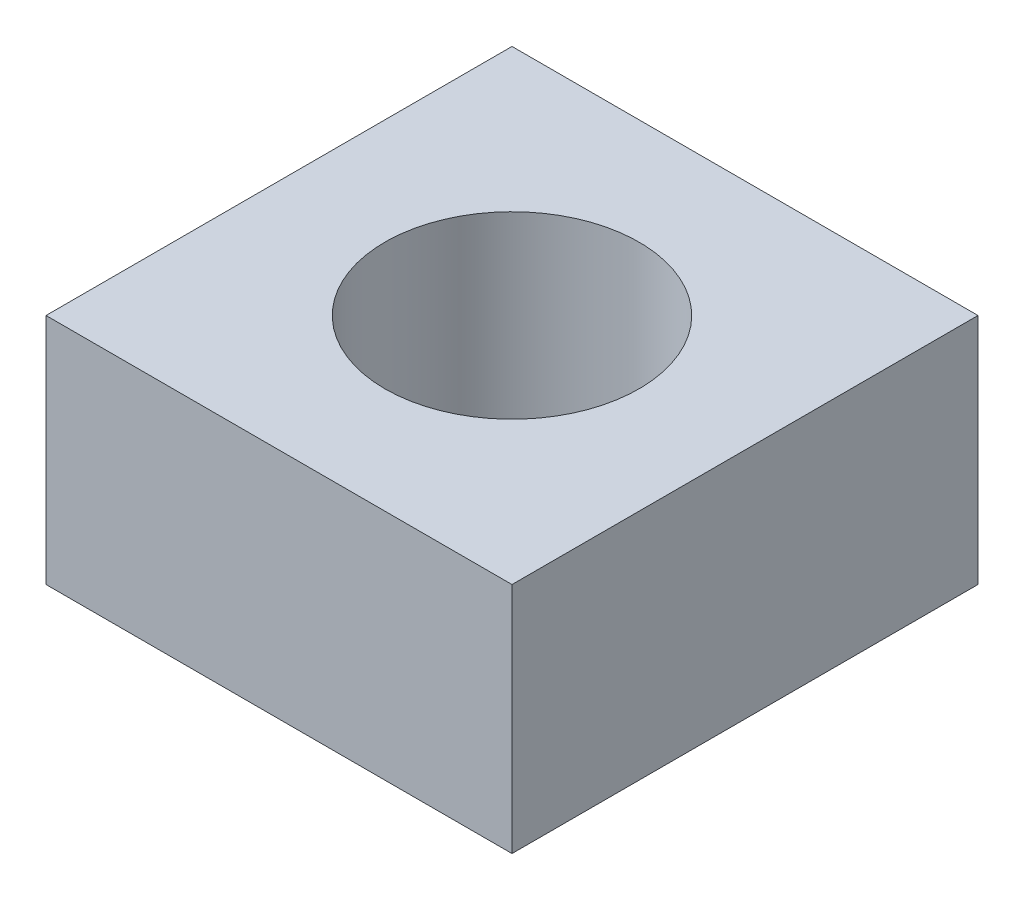
ISO-10303-21;
HEADER;
FILE_DESCRIPTION(('STEP AP214'),'2;1');
FILE_NAME('part.step','',(''),(''),'','','');
FILE_SCHEMA(('AUTOMOTIVE_DESIGN { 1 0 10303 214 1 1 1 1 }'));
ENDSEC;
DATA;
#1=APPLICATION_CONTEXT('core data for automotive mechanical design processes');
#2=APPLICATION_PROTOCOL_DEFINITION('international standard','automotive_design',2000,#1);
#3=PRODUCT_CONTEXT('',#1,'mechanical');
#4=PRODUCT('Part','Part','',(#3));
#5=PRODUCT_RELATED_PRODUCT_CATEGORY('part','',(#4));
#6=PRODUCT_DEFINITION_FORMATION('','',#4);
#7=PRODUCT_DEFINITION_CONTEXT('part definition',#1,'design');
#8=PRODUCT_DEFINITION('design','',#6,#7);
#9=PRODUCT_DEFINITION_SHAPE('','',#8);
#10=(LENGTH_UNIT() NAMED_UNIT(*) SI_UNIT(.MILLI.,.METRE.));
#11=(NAMED_UNIT(*) PLANE_ANGLE_UNIT() SI_UNIT($,.RADIAN.));
#12=(NAMED_UNIT(*) SI_UNIT($,.STERADIAN.) SOLID_ANGLE_UNIT());
#13=UNCERTAINTY_MEASURE_WITH_UNIT(LENGTH_MEASURE(1.E-05),#10,'distance_accuracy_value','');
#14=(GEOMETRIC_REPRESENTATION_CONTEXT(3) GLOBAL_UNCERTAINTY_ASSIGNED_CONTEXT((#13)) GLOBAL_UNIT_ASSIGNED_CONTEXT((#10,
#11,#12)) REPRESENTATION_CONTEXT('',''));
#15=CARTESIAN_POINT('',(0.,0.,0.));
#16=DIRECTION('',(0.,0.,1.));
#17=DIRECTION('',(1.,0.,0.));
#18=AXIS2_PLACEMENT_3D('',#15,#16,#17);
#19=CARTESIAN_POINT('',(0.,5.5,0.));
#20=DIRECTION('',(0.,-1.,0.));
#21=DIRECTION('',(0.,0.,-1.));
#22=AXIS2_PLACEMENT_3D('',#19,#20,#21);
#23=PLANE('',#22);
#24=DIRECTION('',(0.,0.,-1.));
#25=VECTOR('',#24,1.);
#26=CARTESIAN_POINT('',(5.5,5.5,5.5));
#27=LINE('',#26,#25);
#28=CARTESIAN_POINT('',(5.5,5.5,5.5));
#29=VERTEX_POINT('',#28);
#30=CARTESIAN_POINT('',(5.5,5.5,-5.5));
#31=VERTEX_POINT('',#30);
#32=EDGE_CURVE('E89',#29,#31,#27,.T.);
#33=ORIENTED_EDGE('',*,*,#32,.T.);
#34=DIRECTION('',(-1.,0.,0.));
#35=VECTOR('',#34,1.);
#36=CARTESIAN_POINT('',(-5.5,5.5,-5.5));
#37=LINE('',#36,#35);
#38=CARTESIAN_POINT('',(-5.5,5.5,-5.5));
#39=VERTEX_POINT('',#38);
#40=EDGE_CURVE('E84',#31,#39,#37,.T.);
#41=ORIENTED_EDGE('',*,*,#40,.T.);
#42=DIRECTION('',(0.,0.,1.));
#43=VECTOR('',#42,1.);
#44=CARTESIAN_POINT('',(-5.5,5.5,5.5));
#45=LINE('',#44,#43);
#46=CARTESIAN_POINT('',(-5.5,5.5,5.5));
#47=VERTEX_POINT('',#46);
#48=EDGE_CURVE('E87',#39,#47,#45,.T.);
#49=ORIENTED_EDGE('',*,*,#48,.T.);
#50=DIRECTION('',(1.,0.,0.));
#51=VECTOR('',#50,1.);
#52=CARTESIAN_POINT('',(-5.5,5.5,5.5));
#53=LINE('',#52,#51);
#54=EDGE_CURVE('E54',#47,#29,#53,.T.);
#55=ORIENTED_EDGE('',*,*,#54,.T.);
#56=EDGE_LOOP('',(#33,#41,#49,#55));
#57=FACE_BOUND('',#56,.T.);
#58=CARTESIAN_POINT('',(0.,5.5,0.));
#59=DIRECTION('',(0.,1.,0.));
#60=DIRECTION('',(0.,0.,1.));
#61=AXIS2_PLACEMENT_3D('',#58,#59,#60);
#62=CIRCLE('',#61,3.);
#63=CARTESIAN_POINT('',(0.,5.5,3.));
#64=VERTEX_POINT('',#63);
#65=EDGE_CURVE('E104',#64,#64,#62,.T.);
#66=ORIENTED_EDGE('',*,*,#65,.F.);
#67=EDGE_LOOP('',(#66));
#68=FACE_BOUND('',#67,.T.);
#69=ADVANCED_FACE('F37',(#57,#68),#23,.F.);
#70=CARTESIAN_POINT('',(0.,0.,0.));
#71=DIRECTION('',(0.,-1.,0.));
#72=DIRECTION('',(0.,0.,-1.));
#73=AXIS2_PLACEMENT_3D('',#70,#71,#72);
#74=PLANE('',#73);
#75=DIRECTION('',(0.,0.,-1.));
#76=VECTOR('',#75,1.);
#77=CARTESIAN_POINT('',(5.5,0.,5.5));
#78=LINE('',#77,#76);
#79=CARTESIAN_POINT('',(5.5,0.,5.5));
#80=VERTEX_POINT('',#79);
#81=CARTESIAN_POINT('',(5.5,0.,-5.5));
#82=VERTEX_POINT('',#81);
#83=EDGE_CURVE('E101',#80,#82,#78,.T.);
#84=ORIENTED_EDGE('',*,*,#83,.F.);
#85=DIRECTION('',(1.,0.,0.));
#86=VECTOR('',#85,1.);
#87=CARTESIAN_POINT('',(-5.5,0.,5.5));
#88=LINE('',#87,#86);
#89=CARTESIAN_POINT('',(-5.5,0.,5.5));
#90=VERTEX_POINT('',#89);
#91=EDGE_CURVE('E77',#90,#80,#88,.T.);
#92=ORIENTED_EDGE('',*,*,#91,.F.);
#93=DIRECTION('',(0.,0.,1.));
#94=VECTOR('',#93,1.);
#95=CARTESIAN_POINT('',(-5.5,0.,5.5));
#96=LINE('',#95,#94);
#97=CARTESIAN_POINT('',(-5.5,0.,-5.5));
#98=VERTEX_POINT('',#97);
#99=EDGE_CURVE('E71',#98,#90,#96,.T.);
#100=ORIENTED_EDGE('',*,*,#99,.F.);
#101=DIRECTION('',(-1.,0.,0.));
#102=VECTOR('',#101,1.);
#103=CARTESIAN_POINT('',(-5.5,0.,-5.5));
#104=LINE('',#103,#102);
#105=EDGE_CURVE('E93',#82,#98,#104,.T.);
#106=ORIENTED_EDGE('',*,*,#105,.F.);
#107=EDGE_LOOP('',(#84,#92,#100,#106));
#108=FACE_BOUND('',#107,.T.);
#109=CARTESIAN_POINT('',(0.,0.,0.));
#110=DIRECTION('',(0.,1.,0.));
#111=DIRECTION('',(0.,0.,1.));
#112=AXIS2_PLACEMENT_3D('',#109,#110,#111);
#113=CIRCLE('',#112,3.);
#114=CARTESIAN_POINT('',(0.,0.,3.));
#115=VERTEX_POINT('',#114);
#116=EDGE_CURVE('E116',#115,#115,#113,.T.);
#117=ORIENTED_EDGE('',*,*,#116,.T.);
#118=EDGE_LOOP('',(#117));
#119=FACE_BOUND('',#118,.T.);
#120=ADVANCED_FACE('F112',(#108,#119),#74,.T.);
#121=CARTESIAN_POINT('',(5.5,5.5,5.5));
#122=DIRECTION('',(-1.,0.,0.));
#123=DIRECTION('',(0.,0.,1.));
#124=AXIS2_PLACEMENT_3D('',#121,#122,#123);
#125=PLANE('',#124);
#126=ORIENTED_EDGE('',*,*,#83,.T.);
#127=DIRECTION('',(0.,-1.,0.));
#128=VECTOR('',#127,1.);
#129=CARTESIAN_POINT('',(5.5,5.5,-5.5));
#130=LINE('',#129,#128);
#131=EDGE_CURVE('E11',#31,#82,#130,.T.);
#132=ORIENTED_EDGE('',*,*,#131,.F.);
#133=ORIENTED_EDGE('',*,*,#32,.F.);
#134=DIRECTION('',(0.,-1.,0.));
#135=VECTOR('',#134,1.);
#136=CARTESIAN_POINT('',(5.5,5.5,5.5));
#137=LINE('',#136,#135);
#138=EDGE_CURVE('E97',#29,#80,#137,.T.);
#139=ORIENTED_EDGE('',*,*,#138,.T.);
#140=EDGE_LOOP('',(#126,#132,#133,#139));
#141=FACE_BOUND('',#140,.T.);
#142=ADVANCED_FACE('F39',(#141),#125,.F.);
#143=CARTESIAN_POINT('',(-5.5,5.5,-5.5));
#144=DIRECTION('',(0.,0.,1.));
#145=DIRECTION('',(1.,0.,0.));
#146=AXIS2_PLACEMENT_3D('',#143,#144,#145);
#147=PLANE('',#146);
#148=ORIENTED_EDGE('',*,*,#105,.T.);
#149=DIRECTION('',(0.,-1.,0.));
#150=VECTOR('',#149,1.);
#151=CARTESIAN_POINT('',(-5.5,5.5,-5.5));
#152=LINE('',#151,#150);
#153=EDGE_CURVE('E46',#39,#98,#152,.T.);
#154=ORIENTED_EDGE('',*,*,#153,.F.);
#155=ORIENTED_EDGE('',*,*,#40,.F.);
#156=ORIENTED_EDGE('',*,*,#131,.T.);
#157=EDGE_LOOP('',(#148,#154,#155,#156));
#158=FACE_BOUND('',#157,.T.);
#159=ADVANCED_FACE('F92',(#158),#147,.F.);
#160=CARTESIAN_POINT('',(-5.5,5.5,5.5));
#161=DIRECTION('',(1.,0.,0.));
#162=DIRECTION('',(0.,0.,-1.));
#163=AXIS2_PLACEMENT_3D('',#160,#161,#162);
#164=PLANE('',#163);
#165=ORIENTED_EDGE('',*,*,#99,.T.);
#166=DIRECTION('',(0.,-1.,0.));
#167=VECTOR('',#166,1.);
#168=CARTESIAN_POINT('',(-5.5,5.5,5.5));
#169=LINE('',#168,#167);
#170=EDGE_CURVE('E94',#47,#90,#169,.T.);
#171=ORIENTED_EDGE('',*,*,#170,.F.);
#172=ORIENTED_EDGE('',*,*,#48,.F.);
#173=ORIENTED_EDGE('',*,*,#153,.T.);
#174=EDGE_LOOP('',(#165,#171,#172,#173));
#175=FACE_BOUND('',#174,.T.);
#176=ADVANCED_FACE('F95',(#175),#164,.F.);
#177=CARTESIAN_POINT('',(-5.5,5.5,5.5));
#178=DIRECTION('',(0.,0.,-1.));
#179=DIRECTION('',(-1.,0.,0.));
#180=AXIS2_PLACEMENT_3D('',#177,#178,#179);
#181=PLANE('',#180);
#182=ORIENTED_EDGE('',*,*,#91,.T.);
#183=ORIENTED_EDGE('',*,*,#138,.F.);
#184=ORIENTED_EDGE('',*,*,#54,.F.);
#185=ORIENTED_EDGE('',*,*,#170,.T.);
#186=EDGE_LOOP('',(#182,#183,#184,#185));
#187=FACE_BOUND('',#186,.T.);
#188=ADVANCED_FACE('F109',(#187),#181,.F.);
#189=CARTESIAN_POINT('',(0.,5.5,0.));
#190=DIRECTION('',(0.,-1.,0.));
#191=DIRECTION('',(0.,0.,-1.));
#192=AXIS2_PLACEMENT_3D('',#189,#190,#191);
#193=CYLINDRICAL_SURFACE('',#192,3.);
#194=ORIENTED_EDGE('',*,*,#65,.T.);
#195=EDGE_LOOP('',(#194));
#196=FACE_BOUND('',#195,.T.);
#197=ORIENTED_EDGE('',*,*,#116,.F.);
#198=EDGE_LOOP('',(#197));
#199=FACE_BOUND('',#198,.T.);
#200=ADVANCED_FACE('F122',(#196,#199),#193,.F.);
#201=CLOSED_SHELL('',(#69,#120,#142,#159,#176,#188,#200));
#202=MANIFOLD_SOLID_BREP('B2',#201);
#203=ADVANCED_BREP_SHAPE_REPRESENTATION('',(#18,#202),#14);
#204=SHAPE_DEFINITION_REPRESENTATION(#9,#203);
ENDSEC;
END-ISO-10303-21;
